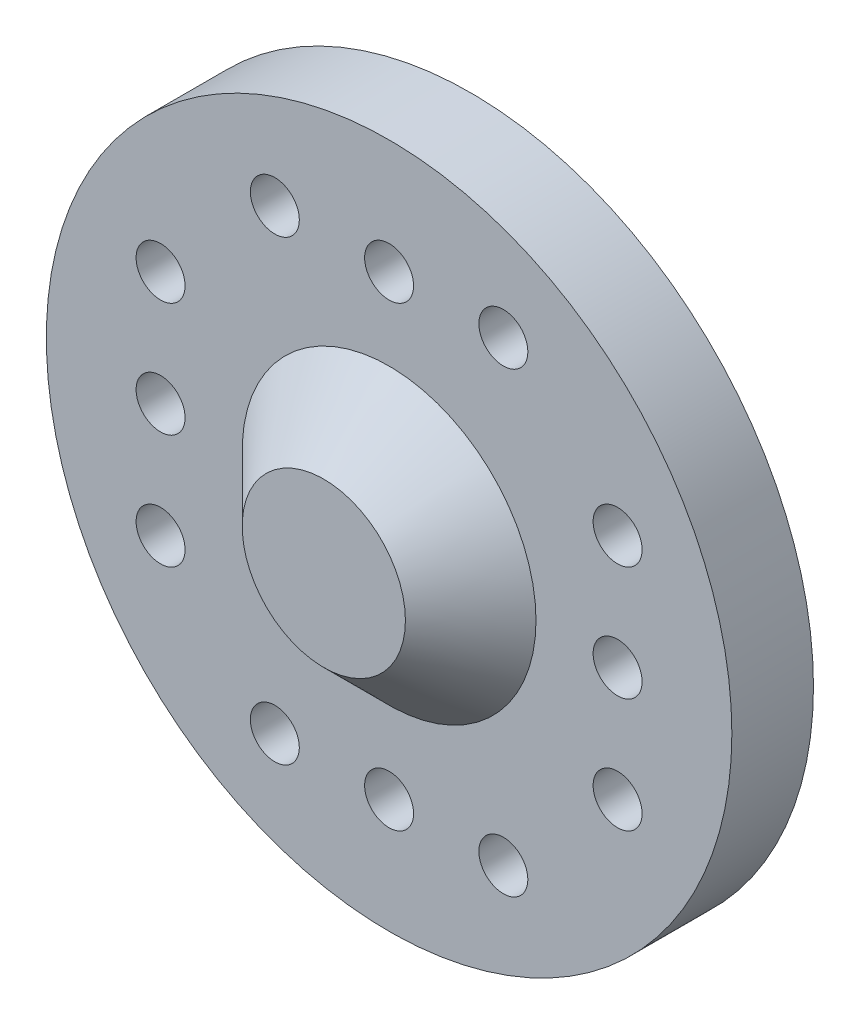
ISO-10303-21;
HEADER;
FILE_DESCRIPTION(('STEP AP214'),'2;1');
FILE_NAME('part.step','',(''),(''),'','','');
FILE_SCHEMA(('AUTOMOTIVE_DESIGN { 1 0 10303 214 1 1 1 1 }'));
ENDSEC;
DATA;
#1=APPLICATION_CONTEXT('core data for automotive mechanical design processes');
#2=APPLICATION_PROTOCOL_DEFINITION('international standard','automotive_design',2000,#1);
#3=PRODUCT_CONTEXT('',#1,'mechanical');
#4=PRODUCT('Part','Part','',(#3));
#5=PRODUCT_RELATED_PRODUCT_CATEGORY('part','',(#4));
#6=PRODUCT_DEFINITION_FORMATION('','',#4);
#7=PRODUCT_DEFINITION_CONTEXT('part definition',#1,'design');
#8=PRODUCT_DEFINITION('design','',#6,#7);
#9=PRODUCT_DEFINITION_SHAPE('','',#8);
#10=(LENGTH_UNIT() NAMED_UNIT(*) SI_UNIT(.MILLI.,.METRE.));
#11=(NAMED_UNIT(*) PLANE_ANGLE_UNIT() SI_UNIT($,.RADIAN.));
#12=(NAMED_UNIT(*) SI_UNIT($,.STERADIAN.) SOLID_ANGLE_UNIT());
#13=UNCERTAINTY_MEASURE_WITH_UNIT(LENGTH_MEASURE(1.E-05),#10,'distance_accuracy_value','');
#14=(GEOMETRIC_REPRESENTATION_CONTEXT(3) GLOBAL_UNCERTAINTY_ASSIGNED_CONTEXT((#13)) GLOBAL_UNIT_ASSIGNED_CONTEXT((#10,
#11,#12)) REPRESENTATION_CONTEXT('',''));
#15=CARTESIAN_POINT('',(0.,0.,0.));
#16=DIRECTION('',(0.,0.,1.));
#17=DIRECTION('',(1.,0.,0.));
#18=AXIS2_PLACEMENT_3D('',#15,#16,#17);
#19=CARTESIAN_POINT('',(0.,0.,2.5));
#20=DIRECTION('',(0.,0.,1.));
#21=DIRECTION('',(1.,0.,0.));
#22=AXIS2_PLACEMENT_3D('',#19,#20,#21);
#23=PLANE('',#22);
#24=CARTESIAN_POINT('',(-7.,3.5,2.5));
#25=DIRECTION('',(0.,0.,1.));
#26=DIRECTION('',(1.,0.,0.));
#27=AXIS2_PLACEMENT_3D('',#24,#25,#26);
#28=CIRCLE('',#27,0.749999999999999);
#29=CARTESIAN_POINT('',(-6.25,3.5,2.5));
#30=VERTEX_POINT('',#29);
#31=EDGE_CURVE('E118',#30,#30,#28,.T.);
#32=ORIENTED_EDGE('',*,*,#31,.F.);
#33=EDGE_LOOP('',(#32));
#34=FACE_BOUND('',#33,.T.);
#35=CARTESIAN_POINT('',(-7.,-3.5,2.5));
#36=DIRECTION('',(0.,0.,1.));
#37=DIRECTION('',(1.,0.,0.));
#38=AXIS2_PLACEMENT_3D('',#35,#36,#37);
#39=CIRCLE('',#38,0.749999999999999);
#40=CARTESIAN_POINT('',(-6.25,-3.5,2.5));
#41=VERTEX_POINT('',#40);
#42=EDGE_CURVE('E112',#41,#41,#39,.T.);
#43=ORIENTED_EDGE('',*,*,#42,.F.);
#44=EDGE_LOOP('',(#43));
#45=FACE_BOUND('',#44,.T.);
#46=CARTESIAN_POINT('',(-3.5,-7.,2.5));
#47=DIRECTION('',(0.,0.,1.));
#48=DIRECTION('',(1.,0.,0.));
#49=AXIS2_PLACEMENT_3D('',#46,#47,#48);
#50=CIRCLE('',#49,0.75);
#51=CARTESIAN_POINT('',(-2.75,-7.,2.5));
#52=VERTEX_POINT('',#51);
#53=EDGE_CURVE('E106',#52,#52,#50,.T.);
#54=ORIENTED_EDGE('',*,*,#53,.F.);
#55=EDGE_LOOP('',(#54));
#56=FACE_BOUND('',#55,.T.);
#57=CARTESIAN_POINT('',(3.5,-7.,2.5));
#58=DIRECTION('',(0.,0.,1.));
#59=DIRECTION('',(1.,0.,0.));
#60=AXIS2_PLACEMENT_3D('',#57,#58,#59);
#61=CIRCLE('',#60,0.749999999999999);
#62=CARTESIAN_POINT('',(4.25,-7.,2.5));
#63=VERTEX_POINT('',#62);
#64=EDGE_CURVE('E100',#63,#63,#61,.T.);
#65=ORIENTED_EDGE('',*,*,#64,.F.);
#66=EDGE_LOOP('',(#65));
#67=FACE_BOUND('',#66,.T.);
#68=CARTESIAN_POINT('',(7.,3.5,2.5));
#69=DIRECTION('',(0.,0.,1.));
#70=DIRECTION('',(1.,0.,0.));
#71=AXIS2_PLACEMENT_3D('',#68,#69,#70);
#72=CIRCLE('',#71,0.749999999999999);
#73=CARTESIAN_POINT('',(7.75,3.5,2.5));
#74=VERTEX_POINT('',#73);
#75=EDGE_CURVE('E94',#74,#74,#72,.T.);
#76=ORIENTED_EDGE('',*,*,#75,.F.);
#77=EDGE_LOOP('',(#76));
#78=FACE_BOUND('',#77,.T.);
#79=CARTESIAN_POINT('',(7.,-3.5,2.5));
#80=DIRECTION('',(0.,0.,1.));
#81=DIRECTION('',(1.,0.,0.));
#82=AXIS2_PLACEMENT_3D('',#79,#80,#81);
#83=CIRCLE('',#82,0.749999999999999);
#84=CARTESIAN_POINT('',(7.75,-3.5,2.5));
#85=VERTEX_POINT('',#84);
#86=EDGE_CURVE('E88',#85,#85,#83,.T.);
#87=ORIENTED_EDGE('',*,*,#86,.F.);
#88=EDGE_LOOP('',(#87));
#89=FACE_BOUND('',#88,.T.);
#90=CARTESIAN_POINT('',(-3.5,7.,2.5));
#91=DIRECTION('',(0.,0.,1.));
#92=DIRECTION('',(1.,0.,0.));
#93=AXIS2_PLACEMENT_3D('',#90,#91,#92);
#94=CIRCLE('',#93,0.75);
#95=CARTESIAN_POINT('',(-2.75,7.,2.5));
#96=VERTEX_POINT('',#95);
#97=EDGE_CURVE('E82',#96,#96,#94,.T.);
#98=ORIENTED_EDGE('',*,*,#97,.F.);
#99=EDGE_LOOP('',(#98));
#100=FACE_BOUND('',#99,.T.);
#101=CARTESIAN_POINT('',(3.5,7.,2.5));
#102=DIRECTION('',(0.,0.,1.));
#103=DIRECTION('',(1.,0.,0.));
#104=AXIS2_PLACEMENT_3D('',#101,#102,#103);
#105=CIRCLE('',#104,0.75);
#106=CARTESIAN_POINT('',(4.25,7.,2.5));
#107=VERTEX_POINT('',#106);
#108=EDGE_CURVE('E76',#107,#107,#105,.T.);
#109=ORIENTED_EDGE('',*,*,#108,.F.);
#110=EDGE_LOOP('',(#109));
#111=FACE_BOUND('',#110,.T.);
#112=CARTESIAN_POINT('',(-7.,0.,2.5));
#113=DIRECTION('',(0.,0.,1.));
#114=DIRECTION('',(1.,0.,0.));
#115=AXIS2_PLACEMENT_3D('',#112,#113,#114);
#116=CIRCLE('',#115,0.749999999999999);
#117=CARTESIAN_POINT('',(-6.25,0.,2.5));
#118=VERTEX_POINT('',#117);
#119=EDGE_CURVE('E70',#118,#118,#116,.T.);
#120=ORIENTED_EDGE('',*,*,#119,.F.);
#121=EDGE_LOOP('',(#120));
#122=FACE_BOUND('',#121,.T.);
#123=CARTESIAN_POINT('',(0.,-7.,2.5));
#124=DIRECTION('',(0.,0.,1.));
#125=DIRECTION('',(1.,0.,0.));
#126=AXIS2_PLACEMENT_3D('',#123,#124,#125);
#127=CIRCLE('',#126,0.75);
#128=CARTESIAN_POINT('',(0.750000000000001,-7.,2.5));
#129=VERTEX_POINT('',#128);
#130=EDGE_CURVE('E64',#129,#129,#127,.T.);
#131=ORIENTED_EDGE('',*,*,#130,.F.);
#132=EDGE_LOOP('',(#131));
#133=FACE_BOUND('',#132,.T.);
#134=CARTESIAN_POINT('',(7.,0.,2.5));
#135=DIRECTION('',(0.,0.,1.));
#136=DIRECTION('',(1.,0.,0.));
#137=AXIS2_PLACEMENT_3D('',#134,#135,#136);
#138=CIRCLE('',#137,0.749999999999999);
#139=CARTESIAN_POINT('',(7.75,0.,2.5));
#140=VERTEX_POINT('',#139);
#141=EDGE_CURVE('E58',#140,#140,#138,.T.);
#142=ORIENTED_EDGE('',*,*,#141,.F.);
#143=EDGE_LOOP('',(#142));
#144=FACE_BOUND('',#143,.T.);
#145=CARTESIAN_POINT('',(0.,7.,2.5));
#146=DIRECTION('',(0.,0.,1.));
#147=DIRECTION('',(1.,0.,0.));
#148=AXIS2_PLACEMENT_3D('',#145,#146,#147);
#149=CIRCLE('',#148,0.75);
#150=CARTESIAN_POINT('',(0.75,7.,2.5));
#151=VERTEX_POINT('',#150);
#152=EDGE_CURVE('E52',#151,#151,#149,.T.);
#153=ORIENTED_EDGE('',*,*,#152,.F.);
#154=EDGE_LOOP('',(#153));
#155=FACE_BOUND('',#154,.T.);
#156=CARTESIAN_POINT('',(0.,0.,2.5));
#157=DIRECTION('',(0.,0.,1.));
#158=DIRECTION('',(1.,0.,0.));
#159=AXIS2_PLACEMENT_3D('',#156,#157,#158);
#160=CIRCLE('',#159,10.5);
#161=CARTESIAN_POINT('',(10.5,0.,2.5));
#162=VERTEX_POINT('',#161);
#163=EDGE_CURVE('E38',#162,#162,#160,.T.);
#164=ORIENTED_EDGE('',*,*,#163,.T.);
#165=EDGE_LOOP('',(#164));
#166=FACE_BOUND('',#165,.T.);
#167=CARTESIAN_POINT('',(0.,0.,2.5));
#168=DIRECTION('',(0.,0.,1.));
#169=DIRECTION('',(1.,0.,0.));
#170=AXIS2_PLACEMENT_3D('',#167,#168,#169);
#171=CIRCLE('',#170,4.5);
#172=CARTESIAN_POINT('',(4.5,0.,2.5));
#173=VERTEX_POINT('',#172);
#174=EDGE_CURVE('E47',#173,#173,#171,.T.);
#175=ORIENTED_EDGE('',*,*,#174,.F.);
#176=EDGE_LOOP('',(#175));
#177=FACE_BOUND('',#176,.T.);
#178=ADVANCED_FACE('F31',(#34,#45,#56,#67,#78,#89,#100,#111,#122,#133,#144,#155,#166,#177),#23,.T.);
#179=CARTESIAN_POINT('',(0.,0.,2.5));
#180=DIRECTION('',(0.,0.,-1.));
#181=DIRECTION('',(-1.,0.,0.));
#182=AXIS2_PLACEMENT_3D('',#179,#180,#181);
#183=CYLINDRICAL_SURFACE('',#182,10.5);
#184=ORIENTED_EDGE('',*,*,#163,.F.);
#185=EDGE_LOOP('',(#184));
#186=FACE_BOUND('',#185,.T.);
#187=CARTESIAN_POINT('',(0.,0.,0.));
#188=DIRECTION('',(0.,0.,1.));
#189=DIRECTION('',(1.,0.,0.));
#190=AXIS2_PLACEMENT_3D('',#187,#188,#189);
#191=CIRCLE('',#190,10.5);
#192=CARTESIAN_POINT('',(10.5,0.,0.));
#193=VERTEX_POINT('',#192);
#194=EDGE_CURVE('E42',#193,#193,#191,.T.);
#195=ORIENTED_EDGE('',*,*,#194,.T.);
#196=EDGE_LOOP('',(#195));
#197=FACE_BOUND('',#196,.T.);
#198=ADVANCED_FACE('F136',(#186,#197),#183,.T.);
#199=CARTESIAN_POINT('',(0.,0.,0.));
#200=DIRECTION('',(0.,0.,1.));
#201=DIRECTION('',(1.,0.,0.));
#202=AXIS2_PLACEMENT_3D('',#199,#200,#201);
#203=PLANE('',#202);
#204=CARTESIAN_POINT('',(-7.,3.5,0.));
#205=DIRECTION('',(0.,0.,1.));
#206=DIRECTION('',(1.,0.,0.));
#207=AXIS2_PLACEMENT_3D('',#204,#205,#206);
#208=CIRCLE('',#207,0.749999999999999);
#209=CARTESIAN_POINT('',(-6.25,3.5,0.));
#210=VERTEX_POINT('',#209);
#211=EDGE_CURVE('E115',#210,#210,#208,.T.);
#212=ORIENTED_EDGE('',*,*,#211,.T.);
#213=EDGE_LOOP('',(#212));
#214=FACE_BOUND('',#213,.T.);
#215=CARTESIAN_POINT('',(-7.,-3.5,0.));
#216=DIRECTION('',(0.,0.,1.));
#217=DIRECTION('',(1.,0.,0.));
#218=AXIS2_PLACEMENT_3D('',#215,#216,#217);
#219=CIRCLE('',#218,0.749999999999999);
#220=CARTESIAN_POINT('',(-6.25,-3.5,0.));
#221=VERTEX_POINT('',#220);
#222=EDGE_CURVE('E109',#221,#221,#219,.T.);
#223=ORIENTED_EDGE('',*,*,#222,.T.);
#224=EDGE_LOOP('',(#223));
#225=FACE_BOUND('',#224,.T.);
#226=CARTESIAN_POINT('',(-3.5,-7.,0.));
#227=DIRECTION('',(0.,0.,1.));
#228=DIRECTION('',(1.,0.,0.));
#229=AXIS2_PLACEMENT_3D('',#226,#227,#228);
#230=CIRCLE('',#229,0.75);
#231=CARTESIAN_POINT('',(-2.75,-7.,0.));
#232=VERTEX_POINT('',#231);
#233=EDGE_CURVE('E103',#232,#232,#230,.T.);
#234=ORIENTED_EDGE('',*,*,#233,.T.);
#235=EDGE_LOOP('',(#234));
#236=FACE_BOUND('',#235,.T.);
#237=CARTESIAN_POINT('',(3.5,-7.,0.));
#238=DIRECTION('',(0.,0.,1.));
#239=DIRECTION('',(1.,0.,0.));
#240=AXIS2_PLACEMENT_3D('',#237,#238,#239);
#241=CIRCLE('',#240,0.749999999999999);
#242=CARTESIAN_POINT('',(4.25,-7.,0.));
#243=VERTEX_POINT('',#242);
#244=EDGE_CURVE('E97',#243,#243,#241,.T.);
#245=ORIENTED_EDGE('',*,*,#244,.T.);
#246=EDGE_LOOP('',(#245));
#247=FACE_BOUND('',#246,.T.);
#248=CARTESIAN_POINT('',(7.,3.5,0.));
#249=DIRECTION('',(0.,0.,1.));
#250=DIRECTION('',(1.,0.,0.));
#251=AXIS2_PLACEMENT_3D('',#248,#249,#250);
#252=CIRCLE('',#251,0.749999999999999);
#253=CARTESIAN_POINT('',(7.75,3.5,0.));
#254=VERTEX_POINT('',#253);
#255=EDGE_CURVE('E91',#254,#254,#252,.T.);
#256=ORIENTED_EDGE('',*,*,#255,.T.);
#257=EDGE_LOOP('',(#256));
#258=FACE_BOUND('',#257,.T.);
#259=CARTESIAN_POINT('',(7.,-3.5,0.));
#260=DIRECTION('',(0.,0.,1.));
#261=DIRECTION('',(1.,0.,0.));
#262=AXIS2_PLACEMENT_3D('',#259,#260,#261);
#263=CIRCLE('',#262,0.749999999999999);
#264=CARTESIAN_POINT('',(7.75,-3.5,0.));
#265=VERTEX_POINT('',#264);
#266=EDGE_CURVE('E85',#265,#265,#263,.T.);
#267=ORIENTED_EDGE('',*,*,#266,.T.);
#268=EDGE_LOOP('',(#267));
#269=FACE_BOUND('',#268,.T.);
#270=CARTESIAN_POINT('',(-3.5,7.,0.));
#271=DIRECTION('',(0.,0.,1.));
#272=DIRECTION('',(1.,0.,0.));
#273=AXIS2_PLACEMENT_3D('',#270,#271,#272);
#274=CIRCLE('',#273,0.75);
#275=CARTESIAN_POINT('',(-2.75,7.,0.));
#276=VERTEX_POINT('',#275);
#277=EDGE_CURVE('E79',#276,#276,#274,.T.);
#278=ORIENTED_EDGE('',*,*,#277,.T.);
#279=EDGE_LOOP('',(#278));
#280=FACE_BOUND('',#279,.T.);
#281=CARTESIAN_POINT('',(3.5,7.,0.));
#282=DIRECTION('',(0.,0.,1.));
#283=DIRECTION('',(1.,0.,0.));
#284=AXIS2_PLACEMENT_3D('',#281,#282,#283);
#285=CIRCLE('',#284,0.75);
#286=CARTESIAN_POINT('',(4.25,7.,0.));
#287=VERTEX_POINT('',#286);
#288=EDGE_CURVE('E73',#287,#287,#285,.T.);
#289=ORIENTED_EDGE('',*,*,#288,.T.);
#290=EDGE_LOOP('',(#289));
#291=FACE_BOUND('',#290,.T.);
#292=CARTESIAN_POINT('',(-7.,0.,0.));
#293=DIRECTION('',(0.,0.,1.));
#294=DIRECTION('',(1.,0.,0.));
#295=AXIS2_PLACEMENT_3D('',#292,#293,#294);
#296=CIRCLE('',#295,0.749999999999999);
#297=CARTESIAN_POINT('',(-6.25,0.,0.));
#298=VERTEX_POINT('',#297);
#299=EDGE_CURVE('E67',#298,#298,#296,.T.);
#300=ORIENTED_EDGE('',*,*,#299,.T.);
#301=EDGE_LOOP('',(#300));
#302=FACE_BOUND('',#301,.T.);
#303=CARTESIAN_POINT('',(0.,-7.,0.));
#304=DIRECTION('',(0.,0.,1.));
#305=DIRECTION('',(1.,0.,0.));
#306=AXIS2_PLACEMENT_3D('',#303,#304,#305);
#307=CIRCLE('',#306,0.75);
#308=CARTESIAN_POINT('',(0.750000000000001,-7.,0.));
#309=VERTEX_POINT('',#308);
#310=EDGE_CURVE('E61',#309,#309,#307,.T.);
#311=ORIENTED_EDGE('',*,*,#310,.T.);
#312=EDGE_LOOP('',(#311));
#313=FACE_BOUND('',#312,.T.);
#314=CARTESIAN_POINT('',(7.,0.,0.));
#315=DIRECTION('',(0.,0.,1.));
#316=DIRECTION('',(1.,0.,0.));
#317=AXIS2_PLACEMENT_3D('',#314,#315,#316);
#318=CIRCLE('',#317,0.749999999999999);
#319=CARTESIAN_POINT('',(7.75,0.,0.));
#320=VERTEX_POINT('',#319);
#321=EDGE_CURVE('E55',#320,#320,#318,.T.);
#322=ORIENTED_EDGE('',*,*,#321,.T.);
#323=EDGE_LOOP('',(#322));
#324=FACE_BOUND('',#323,.T.);
#325=CARTESIAN_POINT('',(0.,7.,0.));
#326=DIRECTION('',(0.,0.,1.));
#327=DIRECTION('',(1.,0.,0.));
#328=AXIS2_PLACEMENT_3D('',#325,#326,#327);
#329=CIRCLE('',#328,0.75);
#330=CARTESIAN_POINT('',(0.75,7.,0.));
#331=VERTEX_POINT('',#330);
#332=EDGE_CURVE('E51',#331,#331,#329,.T.);
#333=ORIENTED_EDGE('',*,*,#332,.T.);
#334=EDGE_LOOP('',(#333));
#335=FACE_BOUND('',#334,.T.);
#336=ORIENTED_EDGE('',*,*,#194,.F.);
#337=EDGE_LOOP('',(#336));
#338=FACE_BOUND('',#337,.T.);
#339=ADVANCED_FACE('F124',(#214,#225,#236,#247,#258,#269,#280,#291,#302,#313,#324,#335,#338),
#203,.F.);
#340=CARTESIAN_POINT('',(0.,0.,4.5));
#341=DIRECTION('',(0.,0.,1.));
#342=DIRECTION('',(1.,0.,0.));
#343=AXIS2_PLACEMENT_3D('',#340,#341,#342);
#344=PLANE('',#343);
#345=CARTESIAN_POINT('',(0.,0.,4.5));
#346=DIRECTION('',(0.,0.,1.));
#347=DIRECTION('',(1.,0.,0.));
#348=AXIS2_PLACEMENT_3D('',#345,#346,#347);
#349=CIRCLE('',#348,2.5);
#350=CARTESIAN_POINT('',(2.5,0.,4.5));
#351=VERTEX_POINT('',#350);
#352=EDGE_CURVE('E10',#351,#351,#349,.T.);
#353=ORIENTED_EDGE('',*,*,#352,.T.);
#354=EDGE_LOOP('',(#353));
#355=FACE_BOUND('',#354,.T.);
#356=ADVANCED_FACE('F165',(#355),#344,.T.);
#357=CARTESIAN_POINT('',(0.,0.,4.5));
#358=DIRECTION('',(0.,0.,-1.));
#359=DIRECTION('',(-1.,0.,0.));
#360=AXIS2_PLACEMENT_3D('',#357,#358,#359);
#361=CONICAL_SURFACE('',#360,2.5,0.785398163397446);
#362=ORIENTED_EDGE('',*,*,#174,.T.);
#363=EDGE_LOOP('',(#362));
#364=FACE_BOUND('',#363,.T.);
#365=ORIENTED_EDGE('',*,*,#352,.F.);
#366=EDGE_LOOP('',(#365));
#367=FACE_BOUND('',#366,.T.);
#368=ADVANCED_FACE('F33',(#364,#367),#361,.T.);
#369=CARTESIAN_POINT('',(0.,7.,0.));
#370=DIRECTION('',(0.,0.,1.));
#371=DIRECTION('',(1.,0.,0.));
#372=AXIS2_PLACEMENT_3D('',#369,#370,#371);
#373=CYLINDRICAL_SURFACE('',#372,0.75);
#374=ORIENTED_EDGE('',*,*,#332,.F.);
#375=EDGE_LOOP('',(#374));
#376=FACE_BOUND('',#375,.T.);
#377=ORIENTED_EDGE('',*,*,#152,.T.);
#378=EDGE_LOOP('',(#377));
#379=FACE_BOUND('',#378,.T.);
#380=ADVANCED_FACE('F164',(#376,#379),#373,.F.);
#381=CARTESIAN_POINT('',(7.,0.,0.));
#382=DIRECTION('',(0.,0.,1.));
#383=DIRECTION('',(1.,0.,0.));
#384=AXIS2_PLACEMENT_3D('',#381,#382,#383);
#385=CYLINDRICAL_SURFACE('',#384,0.749999999999999);
#386=ORIENTED_EDGE('',*,*,#321,.F.);
#387=EDGE_LOOP('',(#386));
#388=FACE_BOUND('',#387,.T.);
#389=ORIENTED_EDGE('',*,*,#141,.T.);
#390=EDGE_LOOP('',(#389));
#391=FACE_BOUND('',#390,.T.);
#392=ADVANCED_FACE('F170',(#388,#391),#385,.F.);
#393=CARTESIAN_POINT('',(0.,-7.,0.));
#394=DIRECTION('',(0.,0.,1.));
#395=DIRECTION('',(1.,0.,0.));
#396=AXIS2_PLACEMENT_3D('',#393,#394,#395);
#397=CYLINDRICAL_SURFACE('',#396,0.75);
#398=ORIENTED_EDGE('',*,*,#310,.F.);
#399=EDGE_LOOP('',(#398));
#400=FACE_BOUND('',#399,.T.);
#401=ORIENTED_EDGE('',*,*,#130,.T.);
#402=EDGE_LOOP('',(#401));
#403=FACE_BOUND('',#402,.T.);
#404=ADVANCED_FACE('F210',(#400,#403),#397,.F.);
#405=CARTESIAN_POINT('',(-7.,0.,0.));
#406=DIRECTION('',(0.,0.,1.));
#407=DIRECTION('',(1.,0.,0.));
#408=AXIS2_PLACEMENT_3D('',#405,#406,#407);
#409=CYLINDRICAL_SURFACE('',#408,0.749999999999999);
#410=ORIENTED_EDGE('',*,*,#299,.F.);
#411=EDGE_LOOP('',(#410));
#412=FACE_BOUND('',#411,.T.);
#413=ORIENTED_EDGE('',*,*,#119,.T.);
#414=EDGE_LOOP('',(#413));
#415=FACE_BOUND('',#414,.T.);
#416=ADVANCED_FACE('F219',(#412,#415),#409,.F.);
#417=CARTESIAN_POINT('',(3.5,7.,0.));
#418=DIRECTION('',(0.,0.,1.));
#419=DIRECTION('',(1.,0.,0.));
#420=AXIS2_PLACEMENT_3D('',#417,#418,#419);
#421=CYLINDRICAL_SURFACE('',#420,0.75);
#422=ORIENTED_EDGE('',*,*,#288,.F.);
#423=EDGE_LOOP('',(#422));
#424=FACE_BOUND('',#423,.T.);
#425=ORIENTED_EDGE('',*,*,#108,.T.);
#426=EDGE_LOOP('',(#425));
#427=FACE_BOUND('',#426,.T.);
#428=ADVANCED_FACE('F229',(#424,#427),#421,.F.);
#429=CARTESIAN_POINT('',(-3.5,7.,0.));
#430=DIRECTION('',(0.,0.,1.));
#431=DIRECTION('',(1.,0.,0.));
#432=AXIS2_PLACEMENT_3D('',#429,#430,#431);
#433=CYLINDRICAL_SURFACE('',#432,0.75);
#434=ORIENTED_EDGE('',*,*,#277,.F.);
#435=EDGE_LOOP('',(#434));
#436=FACE_BOUND('',#435,.T.);
#437=ORIENTED_EDGE('',*,*,#97,.T.);
#438=EDGE_LOOP('',(#437));
#439=FACE_BOUND('',#438,.T.);
#440=ADVANCED_FACE('F239',(#436,#439),#433,.F.);
#441=CARTESIAN_POINT('',(7.,-3.5,0.));
#442=DIRECTION('',(0.,0.,1.));
#443=DIRECTION('',(1.,0.,0.));
#444=AXIS2_PLACEMENT_3D('',#441,#442,#443);
#445=CYLINDRICAL_SURFACE('',#444,0.749999999999999);
#446=ORIENTED_EDGE('',*,*,#266,.F.);
#447=EDGE_LOOP('',(#446));
#448=FACE_BOUND('',#447,.T.);
#449=ORIENTED_EDGE('',*,*,#86,.T.);
#450=EDGE_LOOP('',(#449));
#451=FACE_BOUND('',#450,.T.);
#452=ADVANCED_FACE('F249',(#448,#451),#445,.F.);
#453=CARTESIAN_POINT('',(7.,3.5,0.));
#454=DIRECTION('',(0.,0.,1.));
#455=DIRECTION('',(1.,0.,0.));
#456=AXIS2_PLACEMENT_3D('',#453,#454,#455);
#457=CYLINDRICAL_SURFACE('',#456,0.749999999999999);
#458=ORIENTED_EDGE('',*,*,#255,.F.);
#459=EDGE_LOOP('',(#458));
#460=FACE_BOUND('',#459,.T.);
#461=ORIENTED_EDGE('',*,*,#75,.T.);
#462=EDGE_LOOP('',(#461));
#463=FACE_BOUND('',#462,.T.);
#464=ADVANCED_FACE('F259',(#460,#463),#457,.F.);
#465=CARTESIAN_POINT('',(3.5,-7.,0.));
#466=DIRECTION('',(0.,0.,1.));
#467=DIRECTION('',(1.,0.,0.));
#468=AXIS2_PLACEMENT_3D('',#465,#466,#467);
#469=CYLINDRICAL_SURFACE('',#468,0.749999999999999);
#470=ORIENTED_EDGE('',*,*,#244,.F.);
#471=EDGE_LOOP('',(#470));
#472=FACE_BOUND('',#471,.T.);
#473=ORIENTED_EDGE('',*,*,#64,.T.);
#474=EDGE_LOOP('',(#473));
#475=FACE_BOUND('',#474,.T.);
#476=ADVANCED_FACE('F269',(#472,#475),#469,.F.);
#477=CARTESIAN_POINT('',(-3.5,-7.,0.));
#478=DIRECTION('',(0.,0.,1.));
#479=DIRECTION('',(1.,0.,0.));
#480=AXIS2_PLACEMENT_3D('',#477,#478,#479);
#481=CYLINDRICAL_SURFACE('',#480,0.75);
#482=ORIENTED_EDGE('',*,*,#233,.F.);
#483=EDGE_LOOP('',(#482));
#484=FACE_BOUND('',#483,.T.);
#485=ORIENTED_EDGE('',*,*,#53,.T.);
#486=EDGE_LOOP('',(#485));
#487=FACE_BOUND('',#486,.T.);
#488=ADVANCED_FACE('F279',(#484,#487),#481,.F.);
#489=CARTESIAN_POINT('',(-7.,-3.5,0.));
#490=DIRECTION('',(0.,0.,1.));
#491=DIRECTION('',(1.,0.,0.));
#492=AXIS2_PLACEMENT_3D('',#489,#490,#491);
#493=CYLINDRICAL_SURFACE('',#492,0.749999999999999);
#494=ORIENTED_EDGE('',*,*,#222,.F.);
#495=EDGE_LOOP('',(#494));
#496=FACE_BOUND('',#495,.T.);
#497=ORIENTED_EDGE('',*,*,#42,.T.);
#498=EDGE_LOOP('',(#497));
#499=FACE_BOUND('',#498,.T.);
#500=ADVANCED_FACE('F130',(#496,#499),#493,.F.);
#501=CARTESIAN_POINT('',(-7.,3.5,0.));
#502=DIRECTION('',(0.,0.,1.));
#503=DIRECTION('',(1.,0.,0.));
#504=AXIS2_PLACEMENT_3D('',#501,#502,#503);
#505=CYLINDRICAL_SURFACE('',#504,0.749999999999999);
#506=ORIENTED_EDGE('',*,*,#211,.F.);
#507=EDGE_LOOP('',(#506));
#508=FACE_BOUND('',#507,.T.);
#509=ORIENTED_EDGE('',*,*,#31,.T.);
#510=EDGE_LOOP('',(#509));
#511=FACE_BOUND('',#510,.T.);
#512=ADVANCED_FACE('F127',(#508,#511),#505,.F.);
#513=CLOSED_SHELL('',(#178,#198,#339,#356,#368,#380,#392,#404,#416,#428,#440,#452,#464,#476,
#488,#500,#512));
#514=MANIFOLD_SOLID_BREP('B2',#513);
#515=ADVANCED_BREP_SHAPE_REPRESENTATION('',(#18,#514),#14);
#516=SHAPE_DEFINITION_REPRESENTATION(#9,#515);
ENDSEC;
END-ISO-10303-21;
